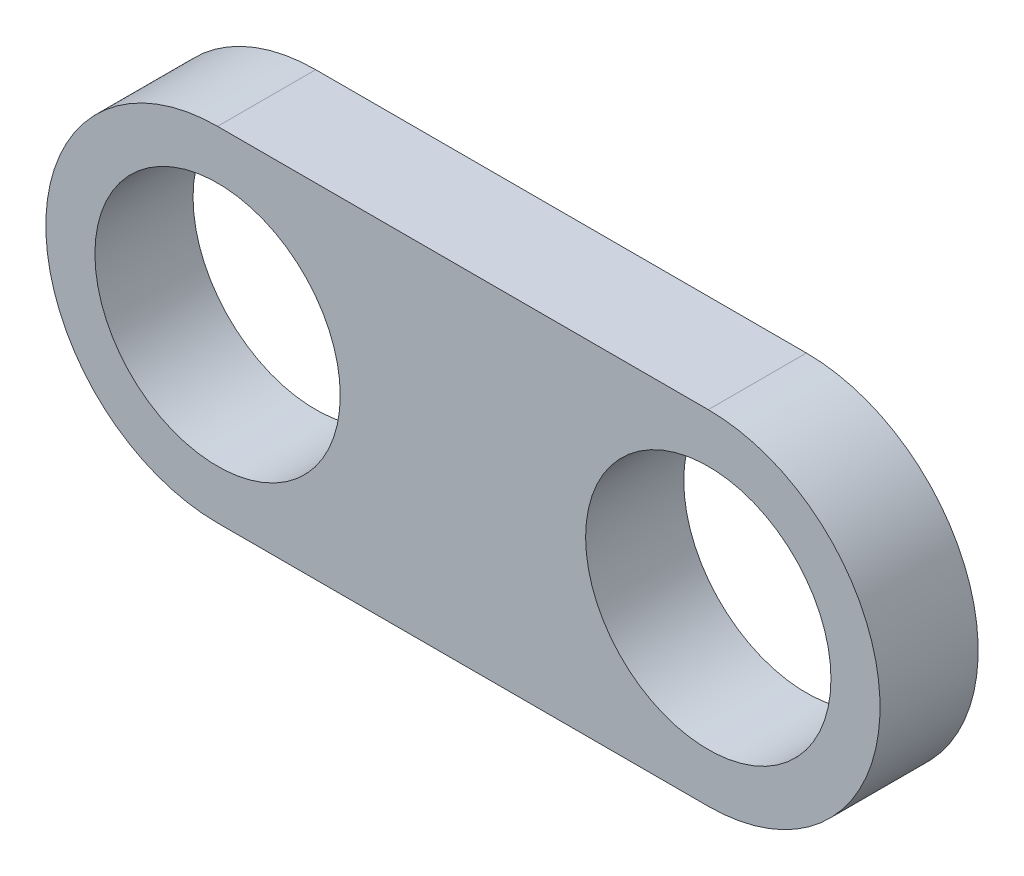
ISO-10303-21;
HEADER;
FILE_DESCRIPTION(('STEP AP214'),'2;1');
FILE_NAME('part.step','',(''),(''),'','','');
FILE_SCHEMA(('AUTOMOTIVE_DESIGN { 1 0 10303 214 1 1 1 1 }'));
ENDSEC;
DATA;
#1=APPLICATION_CONTEXT('core data for automotive mechanical design processes');
#2=APPLICATION_PROTOCOL_DEFINITION('international standard','automotive_design',2000,#1);
#3=PRODUCT_CONTEXT('',#1,'mechanical');
#4=PRODUCT('Part','Part','',(#3));
#5=PRODUCT_RELATED_PRODUCT_CATEGORY('part','',(#4));
#6=PRODUCT_DEFINITION_FORMATION('','',#4);
#7=PRODUCT_DEFINITION_CONTEXT('part definition',#1,'design');
#8=PRODUCT_DEFINITION('design','',#6,#7);
#9=PRODUCT_DEFINITION_SHAPE('','',#8);
#10=(LENGTH_UNIT() NAMED_UNIT(*) SI_UNIT(.MILLI.,.METRE.));
#11=(NAMED_UNIT(*) PLANE_ANGLE_UNIT() SI_UNIT($,.RADIAN.));
#12=(NAMED_UNIT(*) SI_UNIT($,.STERADIAN.) SOLID_ANGLE_UNIT());
#13=UNCERTAINTY_MEASURE_WITH_UNIT(LENGTH_MEASURE(1.E-05),#10,'distance_accuracy_value','');
#14=(GEOMETRIC_REPRESENTATION_CONTEXT(3) GLOBAL_UNCERTAINTY_ASSIGNED_CONTEXT((#13)) GLOBAL_UNIT_ASSIGNED_CONTEXT((#10,
#11,#12)) REPRESENTATION_CONTEXT('',''));
#15=CARTESIAN_POINT('',(0.,0.,0.));
#16=DIRECTION('',(0.,0.,1.));
#17=DIRECTION('',(1.,0.,0.));
#18=AXIS2_PLACEMENT_3D('',#15,#16,#17);
#19=CARTESIAN_POINT('',(0.,0.,19.9999999999999));
#20=DIRECTION('',(0.,0.,1.));
#21=DIRECTION('',(1.,0.,0.));
#22=AXIS2_PLACEMENT_3D('',#19,#20,#21);
#23=PLANE('',#22);
#24=CARTESIAN_POINT('',(0.,0.,19.9999999999999));
#25=DIRECTION('',(0.,0.,1.));
#26=DIRECTION('',(1.,0.,0.));
#27=AXIS2_PLACEMENT_3D('',#24,#25,#26);
#28=CIRCLE('',#27,25.);
#29=CARTESIAN_POINT('',(25.,0.,19.9999999999999));
#30=VERTEX_POINT('',#29);
#31=EDGE_CURVE('E101',#30,#30,#28,.T.);
#32=ORIENTED_EDGE('',*,*,#31,.F.);
#33=EDGE_LOOP('',(#32));
#34=FACE_BOUND('',#33,.T.);
#35=CARTESIAN_POINT('',(0.,0.,19.9999999999999));
#36=DIRECTION('',(0.,0.,1.));
#37=DIRECTION('',(1.,0.,0.));
#38=AXIS2_PLACEMENT_3D('',#35,#36,#37);
#39=CIRCLE('',#38,35.);
#40=CARTESIAN_POINT('',(0.,35.,19.9999999999999));
#41=VERTEX_POINT('',#40);
#42=CARTESIAN_POINT('',(0.,-35.,19.9999999999999));
#43=VERTEX_POINT('',#42);
#44=EDGE_CURVE('E86',#41,#43,#39,.T.);
#45=ORIENTED_EDGE('',*,*,#44,.T.);
#46=DIRECTION('',(1.,0.,0.));
#47=VECTOR('',#46,1.);
#48=CARTESIAN_POINT('',(0.,-35.,19.9999999999999));
#49=LINE('',#48,#47);
#50=CARTESIAN_POINT('',(100.,-35.,19.9999999999999));
#51=VERTEX_POINT('',#50);
#52=EDGE_CURVE('E81',#43,#51,#49,.T.);
#53=ORIENTED_EDGE('',*,*,#52,.T.);
#54=CARTESIAN_POINT('',(100.,0.,19.9999999999999));
#55=DIRECTION('',(0.,0.,1.));
#56=DIRECTION('',(1.,0.,0.));
#57=AXIS2_PLACEMENT_3D('',#54,#55,#56);
#58=CIRCLE('',#57,35.);
#59=CARTESIAN_POINT('',(100.,35.,19.9999999999999));
#60=VERTEX_POINT('',#59);
#61=EDGE_CURVE('E84',#51,#60,#58,.T.);
#62=ORIENTED_EDGE('',*,*,#61,.T.);
#63=DIRECTION('',(-1.,0.,0.));
#64=VECTOR('',#63,1.);
#65=CARTESIAN_POINT('',(0.,35.,19.9999999999999));
#66=LINE('',#65,#64);
#67=EDGE_CURVE('E51',#60,#41,#66,.T.);
#68=ORIENTED_EDGE('',*,*,#67,.T.);
#69=EDGE_LOOP('',(#45,#53,#62,#68));
#70=FACE_BOUND('',#69,.T.);
#71=CARTESIAN_POINT('',(100.,0.,19.9999999999999));
#72=DIRECTION('',(0.,0.,1.));
#73=DIRECTION('',(1.,0.,0.));
#74=AXIS2_PLACEMENT_3D('',#71,#72,#73);
#75=CIRCLE('',#74,25.);
#76=CARTESIAN_POINT('',(125.,0.,19.9999999999999));
#77=VERTEX_POINT('',#76);
#78=EDGE_CURVE('E116',#77,#77,#75,.T.);
#79=ORIENTED_EDGE('',*,*,#78,.F.);
#80=EDGE_LOOP('',(#79));
#81=FACE_BOUND('',#80,.T.);
#82=ADVANCED_FACE('F34',(#34,#70,#81),#23,.T.);
#83=CARTESIAN_POINT('',(0.,0.,0.));
#84=DIRECTION('',(0.,0.,1.));
#85=DIRECTION('',(1.,0.,0.));
#86=AXIS2_PLACEMENT_3D('',#83,#84,#85);
#87=PLANE('',#86);
#88=CARTESIAN_POINT('',(0.,0.,0.));
#89=DIRECTION('',(0.,0.,1.));
#90=DIRECTION('',(1.,0.,0.));
#91=AXIS2_PLACEMENT_3D('',#88,#89,#90);
#92=CIRCLE('',#91,35.);
#93=CARTESIAN_POINT('',(0.,35.,0.));
#94=VERTEX_POINT('',#93);
#95=CARTESIAN_POINT('',(0.,-35.,0.));
#96=VERTEX_POINT('',#95);
#97=EDGE_CURVE('E98',#94,#96,#92,.T.);
#98=ORIENTED_EDGE('',*,*,#97,.F.);
#99=DIRECTION('',(-1.,0.,0.));
#100=VECTOR('',#99,1.);
#101=CARTESIAN_POINT('',(0.,35.,0.));
#102=LINE('',#101,#100);
#103=CARTESIAN_POINT('',(100.,35.,0.));
#104=VERTEX_POINT('',#103);
#105=EDGE_CURVE('E74',#104,#94,#102,.T.);
#106=ORIENTED_EDGE('',*,*,#105,.F.);
#107=CARTESIAN_POINT('',(100.,0.,0.));
#108=DIRECTION('',(0.,0.,1.));
#109=DIRECTION('',(1.,0.,0.));
#110=AXIS2_PLACEMENT_3D('',#107,#108,#109);
#111=CIRCLE('',#110,35.);
#112=CARTESIAN_POINT('',(100.,-35.,0.));
#113=VERTEX_POINT('',#112);
#114=EDGE_CURVE('E68',#113,#104,#111,.T.);
#115=ORIENTED_EDGE('',*,*,#114,.F.);
#116=DIRECTION('',(1.,0.,0.));
#117=VECTOR('',#116,1.);
#118=CARTESIAN_POINT('',(0.,-35.,0.));
#119=LINE('',#118,#117);
#120=EDGE_CURVE('E90',#96,#113,#119,.T.);
#121=ORIENTED_EDGE('',*,*,#120,.F.);
#122=EDGE_LOOP('',(#98,#106,#115,#121));
#123=FACE_BOUND('',#122,.T.);
#124=CARTESIAN_POINT('',(0.,0.,0.));
#125=DIRECTION('',(0.,0.,1.));
#126=DIRECTION('',(1.,0.,0.));
#127=AXIS2_PLACEMENT_3D('',#124,#125,#126);
#128=CIRCLE('',#127,25.);
#129=CARTESIAN_POINT('',(25.,0.,0.));
#130=VERTEX_POINT('',#129);
#131=EDGE_CURVE('E113',#130,#130,#128,.T.);
#132=ORIENTED_EDGE('',*,*,#131,.T.);
#133=EDGE_LOOP('',(#132));
#134=FACE_BOUND('',#133,.T.);
#135=CARTESIAN_POINT('',(100.,0.,0.));
#136=DIRECTION('',(0.,0.,1.));
#137=DIRECTION('',(1.,0.,0.));
#138=AXIS2_PLACEMENT_3D('',#135,#136,#137);
#139=CIRCLE('',#138,25.);
#140=CARTESIAN_POINT('',(125.,0.,0.));
#141=VERTEX_POINT('',#140);
#142=EDGE_CURVE('E119',#141,#141,#139,.T.);
#143=ORIENTED_EDGE('',*,*,#142,.T.);
#144=EDGE_LOOP('',(#143));
#145=FACE_BOUND('',#144,.T.);
#146=ADVANCED_FACE('F109',(#123,#134,#145),#87,.F.);
#147=CARTESIAN_POINT('',(0.,0.,19.9999999999999));
#148=DIRECTION('',(0.,0.,-1.));
#149=DIRECTION('',(-1.,0.,0.));
#150=AXIS2_PLACEMENT_3D('',#147,#148,#149);
#151=CYLINDRICAL_SURFACE('',#150,35.);
#152=ORIENTED_EDGE('',*,*,#97,.T.);
#153=DIRECTION('',(0.,0.,-1.));
#154=VECTOR('',#153,1.);
#155=CARTESIAN_POINT('',(0.,-35.,19.9999999999999));
#156=LINE('',#155,#154);
#157=EDGE_CURVE('E11',#43,#96,#156,.T.);
#158=ORIENTED_EDGE('',*,*,#157,.F.);
#159=ORIENTED_EDGE('',*,*,#44,.F.);
#160=DIRECTION('',(0.,0.,-1.));
#161=VECTOR('',#160,1.);
#162=CARTESIAN_POINT('',(0.,35.,19.9999999999999));
#163=LINE('',#162,#161);
#164=EDGE_CURVE('E94',#41,#94,#163,.T.);
#165=ORIENTED_EDGE('',*,*,#164,.T.);
#166=EDGE_LOOP('',(#152,#158,#159,#165));
#167=FACE_BOUND('',#166,.T.);
#168=ADVANCED_FACE('F36',(#167),#151,.T.);
#169=CARTESIAN_POINT('',(0.,-35.,19.9999999999999));
#170=DIRECTION('',(0.,1.,0.));
#171=DIRECTION('',(0.,0.,1.));
#172=AXIS2_PLACEMENT_3D('',#169,#170,#171);
#173=PLANE('',#172);
#174=ORIENTED_EDGE('',*,*,#120,.T.);
#175=DIRECTION('',(0.,0.,-1.));
#176=VECTOR('',#175,1.);
#177=CARTESIAN_POINT('',(100.,-35.,19.9999999999999));
#178=LINE('',#177,#176);
#179=EDGE_CURVE('E43',#51,#113,#178,.T.);
#180=ORIENTED_EDGE('',*,*,#179,.F.);
#181=ORIENTED_EDGE('',*,*,#52,.F.);
#182=ORIENTED_EDGE('',*,*,#157,.T.);
#183=EDGE_LOOP('',(#174,#180,#181,#182));
#184=FACE_BOUND('',#183,.T.);
#185=ADVANCED_FACE('F89',(#184),#173,.F.);
#186=CARTESIAN_POINT('',(100.,0.,19.9999999999999));
#187=DIRECTION('',(0.,0.,-1.));
#188=DIRECTION('',(-1.,0.,0.));
#189=AXIS2_PLACEMENT_3D('',#186,#187,#188);
#190=CYLINDRICAL_SURFACE('',#189,35.);
#191=ORIENTED_EDGE('',*,*,#114,.T.);
#192=DIRECTION('',(0.,0.,-1.));
#193=VECTOR('',#192,1.);
#194=CARTESIAN_POINT('',(100.,35.,19.9999999999999));
#195=LINE('',#194,#193);
#196=EDGE_CURVE('E91',#60,#104,#195,.T.);
#197=ORIENTED_EDGE('',*,*,#196,.F.);
#198=ORIENTED_EDGE('',*,*,#61,.F.);
#199=ORIENTED_EDGE('',*,*,#179,.T.);
#200=EDGE_LOOP('',(#191,#197,#198,#199));
#201=FACE_BOUND('',#200,.T.);
#202=ADVANCED_FACE('F92',(#201),#190,.T.);
#203=CARTESIAN_POINT('',(0.,35.,19.9999999999999));
#204=DIRECTION('',(0.,-1.,0.));
#205=DIRECTION('',(0.,0.,-1.));
#206=AXIS2_PLACEMENT_3D('',#203,#204,#205);
#207=PLANE('',#206);
#208=ORIENTED_EDGE('',*,*,#105,.T.);
#209=ORIENTED_EDGE('',*,*,#164,.F.);
#210=ORIENTED_EDGE('',*,*,#67,.F.);
#211=ORIENTED_EDGE('',*,*,#196,.T.);
#212=EDGE_LOOP('',(#208,#209,#210,#211));
#213=FACE_BOUND('',#212,.T.);
#214=ADVANCED_FACE('F106',(#213),#207,.F.);
#215=CARTESIAN_POINT('',(0.,0.,19.9999999999999));
#216=DIRECTION('',(0.,0.,-1.));
#217=DIRECTION('',(-1.,0.,0.));
#218=AXIS2_PLACEMENT_3D('',#215,#216,#217);
#219=CYLINDRICAL_SURFACE('',#218,25.);
#220=ORIENTED_EDGE('',*,*,#31,.T.);
#221=EDGE_LOOP('',(#220));
#222=FACE_BOUND('',#221,.T.);
#223=ORIENTED_EDGE('',*,*,#131,.F.);
#224=EDGE_LOOP('',(#223));
#225=FACE_BOUND('',#224,.T.);
#226=ADVANCED_FACE('F136',(#222,#225),#219,.F.);
#227=CARTESIAN_POINT('',(100.,0.,19.9999999999999));
#228=DIRECTION('',(0.,0.,-1.));
#229=DIRECTION('',(-1.,0.,0.));
#230=AXIS2_PLACEMENT_3D('',#227,#228,#229);
#231=CYLINDRICAL_SURFACE('',#230,25.);
#232=ORIENTED_EDGE('',*,*,#78,.T.);
#233=EDGE_LOOP('',(#232));
#234=FACE_BOUND('',#233,.T.);
#235=ORIENTED_EDGE('',*,*,#142,.F.);
#236=EDGE_LOOP('',(#235));
#237=FACE_BOUND('',#236,.T.);
#238=ADVANCED_FACE('F125',(#234,#237),#231,.F.);
#239=CLOSED_SHELL('',(#82,#146,#168,#185,#202,#214,#226,#238));
#240=MANIFOLD_SOLID_BREP('B2',#239);
#241=ADVANCED_BREP_SHAPE_REPRESENTATION('',(#18,#240),#14);
#242=SHAPE_DEFINITION_REPRESENTATION(#9,#241);
ENDSEC;
END-ISO-10303-21;
